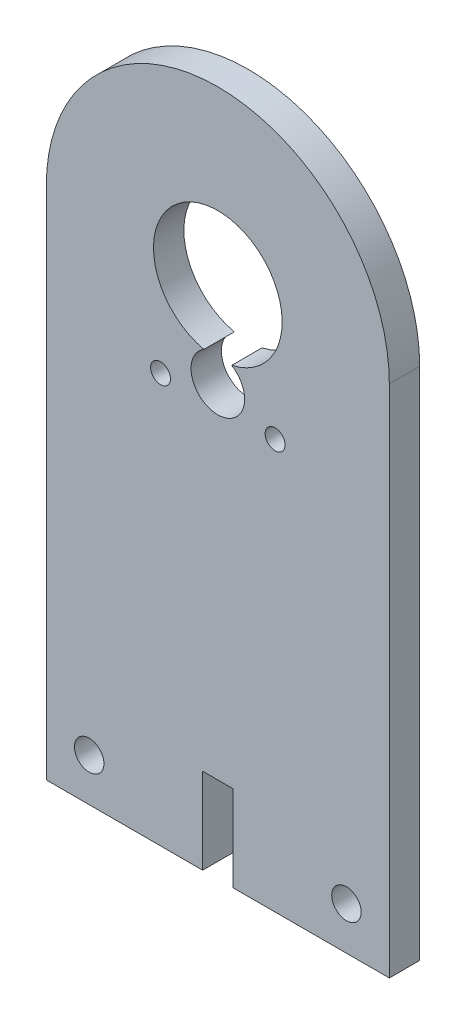
ISO-10303-21;
HEADER;
FILE_DESCRIPTION(('STEP AP214'),'2;1');
FILE_NAME('part.step','',(''),(''),'','','');
FILE_SCHEMA(('AUTOMOTIVE_DESIGN { 1 0 10303 214 1 1 1 1 }'));
ENDSEC;
DATA;
#1=APPLICATION_CONTEXT('core data for automotive mechanical design processes');
#2=APPLICATION_PROTOCOL_DEFINITION('international standard','automotive_design',2000,#1);
#3=PRODUCT_CONTEXT('',#1,'mechanical');
#4=PRODUCT('Part','Part','',(#3));
#5=PRODUCT_RELATED_PRODUCT_CATEGORY('part','',(#4));
#6=PRODUCT_DEFINITION_FORMATION('','',#4);
#7=PRODUCT_DEFINITION_CONTEXT('part definition',#1,'design');
#8=PRODUCT_DEFINITION('design','',#6,#7);
#9=PRODUCT_DEFINITION_SHAPE('','',#8);
#10=(LENGTH_UNIT() NAMED_UNIT(*) SI_UNIT(.MILLI.,.METRE.));
#11=(NAMED_UNIT(*) PLANE_ANGLE_UNIT() SI_UNIT($,.RADIAN.));
#12=(NAMED_UNIT(*) SI_UNIT($,.STERADIAN.) SOLID_ANGLE_UNIT());
#13=UNCERTAINTY_MEASURE_WITH_UNIT(LENGTH_MEASURE(1.E-05),#10,'distance_accuracy_value','');
#14=(GEOMETRIC_REPRESENTATION_CONTEXT(3) GLOBAL_UNCERTAINTY_ASSIGNED_CONTEXT((#13)) GLOBAL_UNIT_ASSIGNED_CONTEXT((#10,
#11,#12)) REPRESENTATION_CONTEXT('',''));
#15=CARTESIAN_POINT('',(0.,0.,0.));
#16=DIRECTION('',(0.,0.,1.));
#17=DIRECTION('',(1.,0.,0.));
#18=AXIS2_PLACEMENT_3D('',#15,#16,#17);
#19=CARTESIAN_POINT('',(0.,0.,4.4958));
#20=DIRECTION('',(0.,1.,0.));
#21=DIRECTION('',(0.,0.,1.));
#22=AXIS2_PLACEMENT_3D('',#19,#20,#21);
#23=PLANE('',#22);
#24=DIRECTION('',(1.,0.,0.));
#25=VECTOR('',#24,1.);
#26=CARTESIAN_POINT('',(0.,0.,0.));
#27=LINE('',#26,#25);
#28=CARTESIAN_POINT('',(0.,0.,0.));
#29=VERTEX_POINT('',#28);
#30=CARTESIAN_POINT('',(23.1521,0.,0.));
#31=VERTEX_POINT('',#30);
#32=EDGE_CURVE('E163',#29,#31,#27,.T.);
#33=ORIENTED_EDGE('',*,*,#32,.T.);
#34=DIRECTION('',(0.,0.,1.));
#35=VECTOR('',#34,1.);
#36=CARTESIAN_POINT('',(23.1521,0.,-1.8542));
#37=LINE('',#36,#35);
#38=CARTESIAN_POINT('',(23.1521,0.,4.4958));
#39=VERTEX_POINT('',#38);
#40=EDGE_CURVE('E138',#31,#39,#37,.T.);
#41=ORIENTED_EDGE('',*,*,#40,.T.);
#42=DIRECTION('',(1.,0.,0.));
#43=VECTOR('',#42,1.);
#44=CARTESIAN_POINT('',(0.,0.,4.4958));
#45=LINE('',#44,#43);
#46=CARTESIAN_POINT('',(0.,0.,4.4958));
#47=VERTEX_POINT('',#46);
#48=EDGE_CURVE('E152',#47,#39,#45,.T.);
#49=ORIENTED_EDGE('',*,*,#48,.F.);
#50=DIRECTION('',(0.,0.,-1.));
#51=VECTOR('',#50,1.);
#52=CARTESIAN_POINT('',(0.,0.,4.4958));
#53=LINE('',#52,#51);
#54=EDGE_CURVE('E177',#47,#29,#53,.T.);
#55=ORIENTED_EDGE('',*,*,#54,.T.);
#56=EDGE_LOOP('',(#33,#41,#49,#55));
#57=FACE_BOUND('',#56,.T.);
#58=ADVANCED_FACE('F36',(#57),#23,.F.);
#59=CARTESIAN_POINT('',(0.,0.,4.4958));
#60=DIRECTION('',(1.,0.,0.));
#61=DIRECTION('',(0.,0.,-1.));
#62=AXIS2_PLACEMENT_3D('',#59,#60,#61);
#63=PLANE('',#62);
#64=DIRECTION('',(0.,-1.,0.));
#65=VECTOR('',#64,1.);
#66=CARTESIAN_POINT('',(0.,0.,0.));
#67=LINE('',#66,#65);
#68=CARTESIAN_POINT('',(0.,76.2,0.));
#69=VERTEX_POINT('',#68);
#70=EDGE_CURVE('E141',#69,#29,#67,.T.);
#71=ORIENTED_EDGE('',*,*,#70,.T.);
#72=ORIENTED_EDGE('',*,*,#54,.F.);
#73=DIRECTION('',(0.,-1.,0.));
#74=VECTOR('',#73,1.);
#75=CARTESIAN_POINT('',(0.,0.,4.4958));
#76=LINE('',#75,#74);
#77=CARTESIAN_POINT('',(0.,76.2,4.4958));
#78=VERTEX_POINT('',#77);
#79=EDGE_CURVE('E147',#78,#47,#76,.T.);
#80=ORIENTED_EDGE('',*,*,#79,.F.);
#81=DIRECTION('',(0.,0.,-1.));
#82=VECTOR('',#81,1.);
#83=CARTESIAN_POINT('',(0.,76.2,4.4958));
#84=LINE('',#83,#82);
#85=EDGE_CURVE('E159',#78,#69,#84,.T.);
#86=ORIENTED_EDGE('',*,*,#85,.T.);
#87=EDGE_LOOP('',(#71,#72,#80,#86));
#88=FACE_BOUND('',#87,.T.);
#89=ADVANCED_FACE('F38',(#88),#63,.F.);
#90=CARTESIAN_POINT('',(27.6479,0.,4.4958));
#91=VERTEX_POINT('',#90);
#92=CARTESIAN_POINT('',(50.8,0.,4.4958));
#93=VERTEX_POINT('',#92);
#94=EDGE_CURVE('E150',#91,#93,#45,.T.);
#95=ORIENTED_EDGE('',*,*,#94,.F.);
#96=DIRECTION('',(0.,0.,1.));
#97=VECTOR('',#96,1.);
#98=CARTESIAN_POINT('',(27.6479,0.,-1.8542));
#99=LINE('',#98,#97);
#100=CARTESIAN_POINT('',(27.6479,0.,0.));
#101=VERTEX_POINT('',#100);
#102=EDGE_CURVE('E143',#101,#91,#99,.T.);
#103=ORIENTED_EDGE('',*,*,#102,.F.);
#104=CARTESIAN_POINT('',(50.8,0.,0.));
#105=VERTEX_POINT('',#104);
#106=EDGE_CURVE('E162',#101,#105,#27,.T.);
#107=ORIENTED_EDGE('',*,*,#106,.T.);
#108=DIRECTION('',(0.,0.,-1.));
#109=VECTOR('',#108,1.);
#110=CARTESIAN_POINT('',(50.8,0.,4.4958));
#111=LINE('',#110,#109);
#112=EDGE_CURVE('E174',#93,#105,#111,.T.);
#113=ORIENTED_EDGE('',*,*,#112,.F.);
#114=EDGE_LOOP('',(#95,#103,#107,#113));
#115=FACE_BOUND('',#114,.T.);
#116=ADVANCED_FACE('F209',(#115),#23,.F.);
#117=CARTESIAN_POINT('',(50.8,0.,4.4958));
#118=DIRECTION('',(-1.,0.,0.));
#119=DIRECTION('',(0.,0.,1.));
#120=AXIS2_PLACEMENT_3D('',#117,#118,#119);
#121=PLANE('',#120);
#122=DIRECTION('',(0.,1.,0.));
#123=VECTOR('',#122,1.);
#124=CARTESIAN_POINT('',(50.8,0.,0.));
#125=LINE('',#124,#123);
#126=CARTESIAN_POINT('',(50.8,76.2,0.));
#127=VERTEX_POINT('',#126);
#128=EDGE_CURVE('E166',#105,#127,#125,.T.);
#129=ORIENTED_EDGE('',*,*,#128,.T.);
#130=DIRECTION('',(0.,0.,-1.));
#131=VECTOR('',#130,1.);
#132=CARTESIAN_POINT('',(50.8,76.2,4.4958));
#133=LINE('',#132,#131);
#134=CARTESIAN_POINT('',(50.8,76.2,4.4958));
#135=VERTEX_POINT('',#134);
#136=EDGE_CURVE('E171',#135,#127,#133,.T.);
#137=ORIENTED_EDGE('',*,*,#136,.F.);
#138=DIRECTION('',(0.,1.,0.));
#139=VECTOR('',#138,1.);
#140=CARTESIAN_POINT('',(50.8,0.,4.4958));
#141=LINE('',#140,#139);
#142=EDGE_CURVE('E155',#93,#135,#141,.T.);
#143=ORIENTED_EDGE('',*,*,#142,.F.);
#144=ORIENTED_EDGE('',*,*,#112,.T.);
#145=EDGE_LOOP('',(#129,#137,#143,#144));
#146=FACE_BOUND('',#145,.T.);
#147=ADVANCED_FACE('F205',(#146),#121,.F.);
#148=CARTESIAN_POINT('',(25.4,76.2,4.4958));
#149=DIRECTION('',(0.,0.,-1.));
#150=DIRECTION('',(-1.,0.,0.));
#151=AXIS2_PLACEMENT_3D('',#148,#149,#150);
#152=CYLINDRICAL_SURFACE('',#151,25.4);
#153=CARTESIAN_POINT('',(25.4,76.2,0.));
#154=DIRECTION('',(0.,0.,1.));
#155=DIRECTION('',(1.,0.,0.));
#156=AXIS2_PLACEMENT_3D('',#153,#154,#155);
#157=CIRCLE('',#156,25.4);
#158=EDGE_CURVE('E151',#127,#69,#157,.T.);
#159=ORIENTED_EDGE('',*,*,#158,.T.);
#160=ORIENTED_EDGE('',*,*,#85,.F.);
#161=CARTESIAN_POINT('',(25.4,76.2,4.4958));
#162=DIRECTION('',(0.,0.,1.));
#163=DIRECTION('',(1.,0.,0.));
#164=AXIS2_PLACEMENT_3D('',#161,#162,#163);
#165=CIRCLE('',#164,25.4);
#166=EDGE_CURVE('E157',#135,#78,#165,.T.);
#167=ORIENTED_EDGE('',*,*,#166,.F.);
#168=ORIENTED_EDGE('',*,*,#136,.T.);
#169=EDGE_LOOP('',(#159,#160,#167,#168));
#170=FACE_BOUND('',#169,.T.);
#171=ADVANCED_FACE('F200',(#170),#152,.T.);
#172=CARTESIAN_POINT('',(25.4,76.2,4.4958));
#173=DIRECTION('',(0.,0.,1.));
#174=DIRECTION('',(1.,0.,0.));
#175=AXIS2_PLACEMENT_3D('',#172,#173,#174);
#176=PLANE('',#175);
#177=CARTESIAN_POINT('',(44.45,6.35,4.4958));
#178=DIRECTION('',(0.,0.,-1.));
#179=DIRECTION('',(-1.,0.,0.));
#180=AXIS2_PLACEMENT_3D('',#177,#178,#179);
#181=CIRCLE('',#180,2.182876);
#182=CARTESIAN_POINT('',(42.267124,6.35,4.4958));
#183=VERTEX_POINT('',#182);
#184=EDGE_CURVE('E251',#183,#183,#181,.T.);
#185=ORIENTED_EDGE('',*,*,#184,.T.);
#186=EDGE_LOOP('',(#185));
#187=FACE_BOUND('',#186,.T.);
#188=CARTESIAN_POINT('',(6.35,6.35,4.4958));
#189=DIRECTION('',(0.,0.,-1.));
#190=DIRECTION('',(-1.,0.,0.));
#191=AXIS2_PLACEMENT_3D('',#188,#189,#190);
#192=CIRCLE('',#191,2.182876);
#193=CARTESIAN_POINT('',(4.167124,6.35,4.4958));
#194=VERTEX_POINT('',#193);
#195=EDGE_CURVE('E255',#194,#194,#192,.T.);
#196=ORIENTED_EDGE('',*,*,#195,.T.);
#197=EDGE_LOOP('',(#196));
#198=FACE_BOUND('',#197,.T.);
#199=CARTESIAN_POINT('',(25.4,63.5,4.4958));
#200=DIRECTION('',(0.,0.,1.));
#201=DIRECTION('',(1.,0.,0.));
#202=AXIS2_PLACEMENT_3D('',#199,#200,#201);
#203=CIRCLE('',#202,3.96875);
#204=CARTESIAN_POINT('',(23.3498959544464,66.8982421875,4.4958));
#205=VERTEX_POINT('',#204);
#206=CARTESIAN_POINT('',(27.4501040455536,66.8982421875,4.4958));
#207=VERTEX_POINT('',#206);
#208=EDGE_CURVE('E112',#205,#207,#203,.T.);
#209=ORIENTED_EDGE('',*,*,#208,.F.);
#210=CARTESIAN_POINT('',(25.4,76.2,4.4958));
#211=DIRECTION('',(0.,0.,1.));
#212=DIRECTION('',(1.,0.,0.));
#213=AXIS2_PLACEMENT_3D('',#210,#211,#212);
#214=CIRCLE('',#213,9.525);
#215=EDGE_CURVE('E126',#207,#205,#214,.T.);
#216=ORIENTED_EDGE('',*,*,#215,.F.);
#217=EDGE_LOOP('',(#209,#216));
#218=FACE_BOUND('',#217,.T.);
#219=CARTESIAN_POINT('',(16.9164,60.6298,4.4958));
#220=DIRECTION('',(0.,0.,1.));
#221=DIRECTION('',(1.,0.,0.));
#222=AXIS2_PLACEMENT_3D('',#219,#220,#221);
#223=CIRCLE('',#222,1.47319999999999);
#224=CARTESIAN_POINT('',(18.3896,60.6298,4.4958));
#225=VERTEX_POINT('',#224);
#226=EDGE_CURVE('E122',#225,#225,#223,.T.);
#227=ORIENTED_EDGE('',*,*,#226,.F.);
#228=EDGE_LOOP('',(#227));
#229=FACE_BOUND('',#228,.T.);
#230=CARTESIAN_POINT('',(33.8836,60.6298,4.4958));
#231=DIRECTION('',(0.,0.,1.));
#232=DIRECTION('',(1.,0.,0.));
#233=AXIS2_PLACEMENT_3D('',#230,#231,#232);
#234=CIRCLE('',#233,1.47319999999999);
#235=CARTESIAN_POINT('',(35.3568,60.6298,4.4958));
#236=VERTEX_POINT('',#235);
#237=EDGE_CURVE('E262',#236,#236,#234,.T.);
#238=ORIENTED_EDGE('',*,*,#237,.F.);
#239=EDGE_LOOP('',(#238));
#240=FACE_BOUND('',#239,.T.);
#241=DIRECTION('',(0.,-1.,0.));
#242=VECTOR('',#241,1.);
#243=CARTESIAN_POINT('',(23.1521,0.,4.4958));
#244=LINE('',#243,#242);
#245=CARTESIAN_POINT('',(23.1521,12.7,4.4958));
#246=VERTEX_POINT('',#245);
#247=EDGE_CURVE('E125',#246,#39,#244,.T.);
#248=ORIENTED_EDGE('',*,*,#247,.F.);
#249=DIRECTION('',(-1.,0.,0.));
#250=VECTOR('',#249,1.);
#251=CARTESIAN_POINT('',(23.1521,12.7,4.4958));
#252=LINE('',#251,#250);
#253=CARTESIAN_POINT('',(27.6479,12.7,4.4958));
#254=VERTEX_POINT('',#253);
#255=EDGE_CURVE('E135',#254,#246,#252,.T.);
#256=ORIENTED_EDGE('',*,*,#255,.F.);
#257=DIRECTION('',(0.,1.,0.));
#258=VECTOR('',#257,1.);
#259=CARTESIAN_POINT('',(27.6479,0.,4.4958));
#260=LINE('',#259,#258);
#261=EDGE_CURVE('E128',#91,#254,#260,.T.);
#262=ORIENTED_EDGE('',*,*,#261,.F.);
#263=ORIENTED_EDGE('',*,*,#94,.T.);
#264=ORIENTED_EDGE('',*,*,#142,.T.);
#265=ORIENTED_EDGE('',*,*,#166,.T.);
#266=ORIENTED_EDGE('',*,*,#79,.T.);
#267=ORIENTED_EDGE('',*,*,#48,.T.);
#268=EDGE_LOOP('',(#248,#256,#262,#263,#264,#265,#266,#267));
#269=FACE_BOUND('',#268,.T.);
#270=ADVANCED_FACE('F216',(#187,#198,#218,#229,#240,#269),#176,.T.);
#271=CARTESIAN_POINT('',(25.4,76.2,0.));
#272=DIRECTION('',(0.,0.,1.));
#273=DIRECTION('',(1.,0.,0.));
#274=AXIS2_PLACEMENT_3D('',#271,#272,#273);
#275=PLANE('',#274);
#276=CARTESIAN_POINT('',(44.45,6.35,0.));
#277=DIRECTION('',(0.,0.,-1.));
#278=DIRECTION('',(-1.,0.,0.));
#279=AXIS2_PLACEMENT_3D('',#276,#277,#278);
#280=CIRCLE('',#279,2.18287599999999);
#281=CARTESIAN_POINT('',(42.267124,6.35,0.));
#282=VERTEX_POINT('',#281);
#283=EDGE_CURVE('E277',#282,#282,#280,.T.);
#284=ORIENTED_EDGE('',*,*,#283,.F.);
#285=EDGE_LOOP('',(#284));
#286=FACE_BOUND('',#285,.T.);
#287=CARTESIAN_POINT('',(6.35,6.35,0.));
#288=DIRECTION('',(0.,0.,-1.));
#289=DIRECTION('',(-1.,0.,0.));
#290=AXIS2_PLACEMENT_3D('',#287,#288,#289);
#291=CIRCLE('',#290,2.18287599999999);
#292=CARTESIAN_POINT('',(4.16712400000001,6.35,0.));
#293=VERTEX_POINT('',#292);
#294=EDGE_CURVE('E273',#293,#293,#291,.T.);
#295=ORIENTED_EDGE('',*,*,#294,.F.);
#296=EDGE_LOOP('',(#295));
#297=FACE_BOUND('',#296,.T.);
#298=CARTESIAN_POINT('',(16.9164,60.6298,0.));
#299=DIRECTION('',(0.,0.,1.));
#300=DIRECTION('',(1.,0.,0.));
#301=AXIS2_PLACEMENT_3D('',#298,#299,#300);
#302=CIRCLE('',#301,1.4732);
#303=CARTESIAN_POINT('',(18.3896,60.6298,0.));
#304=VERTEX_POINT('',#303);
#305=EDGE_CURVE('E264',#304,#304,#302,.T.);
#306=ORIENTED_EDGE('',*,*,#305,.T.);
#307=EDGE_LOOP('',(#306));
#308=FACE_BOUND('',#307,.T.);
#309=CARTESIAN_POINT('',(33.8836,60.6298,0.));
#310=DIRECTION('',(0.,0.,1.));
#311=DIRECTION('',(1.,0.,0.));
#312=AXIS2_PLACEMENT_3D('',#309,#310,#311);
#313=CIRCLE('',#312,1.4732);
#314=CARTESIAN_POINT('',(35.3568,60.6298,0.));
#315=VERTEX_POINT('',#314);
#316=EDGE_CURVE('E130',#315,#315,#313,.T.);
#317=ORIENTED_EDGE('',*,*,#316,.T.);
#318=EDGE_LOOP('',(#317));
#319=FACE_BOUND('',#318,.T.);
#320=CARTESIAN_POINT('',(25.4,76.2,0.));
#321=DIRECTION('',(0.,0.,1.));
#322=DIRECTION('',(1.,0.,0.));
#323=AXIS2_PLACEMENT_3D('',#320,#321,#322);
#324=CIRCLE('',#323,9.525);
#325=CARTESIAN_POINT('',(27.4501040455536,66.8982421875,0.));
#326=VERTEX_POINT('',#325);
#327=CARTESIAN_POINT('',(23.3498959544464,66.8982421875,0.));
#328=VERTEX_POINT('',#327);
#329=EDGE_CURVE('E121',#326,#328,#324,.T.);
#330=ORIENTED_EDGE('',*,*,#329,.T.);
#331=CARTESIAN_POINT('',(25.4,63.5,0.));
#332=DIRECTION('',(0.,0.,1.));
#333=DIRECTION('',(1.,0.,0.));
#334=AXIS2_PLACEMENT_3D('',#331,#332,#333);
#335=CIRCLE('',#334,3.96875);
#336=EDGE_CURVE('E51',#328,#326,#335,.T.);
#337=ORIENTED_EDGE('',*,*,#336,.T.);
#338=EDGE_LOOP('',(#330,#337));
#339=FACE_BOUND('',#338,.T.);
#340=DIRECTION('',(-1.,0.,0.));
#341=VECTOR('',#340,1.);
#342=CARTESIAN_POINT('',(25.4,12.7,0.));
#343=LINE('',#342,#341);
#344=CARTESIAN_POINT('',(27.6479,12.7,0.));
#345=VERTEX_POINT('',#344);
#346=CARTESIAN_POINT('',(23.1521,12.7,0.));
#347=VERTEX_POINT('',#346);
#348=EDGE_CURVE('E183',#345,#347,#343,.T.);
#349=ORIENTED_EDGE('',*,*,#348,.T.);
#350=DIRECTION('',(0.,-1.,0.));
#351=VECTOR('',#350,1.);
#352=CARTESIAN_POINT('',(23.1521,76.2,0.));
#353=LINE('',#352,#351);
#354=EDGE_CURVE('E186',#347,#31,#353,.T.);
#355=ORIENTED_EDGE('',*,*,#354,.T.);
#356=ORIENTED_EDGE('',*,*,#32,.F.);
#357=ORIENTED_EDGE('',*,*,#70,.F.);
#358=ORIENTED_EDGE('',*,*,#158,.F.);
#359=ORIENTED_EDGE('',*,*,#128,.F.);
#360=ORIENTED_EDGE('',*,*,#106,.F.);
#361=DIRECTION('',(0.,1.,0.));
#362=VECTOR('',#361,1.);
#363=CARTESIAN_POINT('',(27.6479,76.2,0.));
#364=LINE('',#363,#362);
#365=EDGE_CURVE('E180',#101,#345,#364,.T.);
#366=ORIENTED_EDGE('',*,*,#365,.T.);
#367=EDGE_LOOP('',(#349,#355,#356,#357,#358,#359,#360,#366));
#368=FACE_BOUND('',#367,.T.);
#369=ADVANCED_FACE('F119',(#286,#297,#308,#319,#339,#368),#275,.F.);
#370=CARTESIAN_POINT('',(23.1521,0.,-1.8542));
#371=DIRECTION('',(-1.,0.,0.));
#372=DIRECTION('',(0.,0.,1.));
#373=AXIS2_PLACEMENT_3D('',#370,#371,#372);
#374=PLANE('',#373);
#375=DIRECTION('',(0.,0.,1.));
#376=VECTOR('',#375,1.);
#377=CARTESIAN_POINT('',(23.1521,12.7,-1.8542));
#378=LINE('',#377,#376);
#379=EDGE_CURVE('E139',#347,#246,#378,.T.);
#380=ORIENTED_EDGE('',*,*,#379,.T.);
#381=ORIENTED_EDGE('',*,*,#247,.T.);
#382=ORIENTED_EDGE('',*,*,#40,.F.);
#383=ORIENTED_EDGE('',*,*,#354,.F.);
#384=EDGE_LOOP('',(#380,#381,#382,#383));
#385=FACE_BOUND('',#384,.T.);
#386=ADVANCED_FACE('F219',(#385),#374,.F.);
#387=CARTESIAN_POINT('',(23.1521,12.7,-1.8542));
#388=DIRECTION('',(0.,1.,0.));
#389=DIRECTION('',(0.,0.,1.));
#390=AXIS2_PLACEMENT_3D('',#387,#388,#389);
#391=PLANE('',#390);
#392=DIRECTION('',(0.,0.,1.));
#393=VECTOR('',#392,1.);
#394=CARTESIAN_POINT('',(27.6479,12.7,-1.8542));
#395=LINE('',#394,#393);
#396=EDGE_CURVE('E59',#345,#254,#395,.T.);
#397=ORIENTED_EDGE('',*,*,#396,.T.);
#398=ORIENTED_EDGE('',*,*,#255,.T.);
#399=ORIENTED_EDGE('',*,*,#379,.F.);
#400=ORIENTED_EDGE('',*,*,#348,.F.);
#401=EDGE_LOOP('',(#397,#398,#399,#400));
#402=FACE_BOUND('',#401,.T.);
#403=ADVANCED_FACE('F218',(#402),#391,.F.);
#404=CARTESIAN_POINT('',(27.6479,0.,-1.8542));
#405=DIRECTION('',(1.,0.,0.));
#406=DIRECTION('',(0.,1.,0.));
#407=AXIS2_PLACEMENT_3D('',#404,#405,#406);
#408=PLANE('',#407);
#409=ORIENTED_EDGE('',*,*,#102,.T.);
#410=ORIENTED_EDGE('',*,*,#261,.T.);
#411=ORIENTED_EDGE('',*,*,#396,.F.);
#412=ORIENTED_EDGE('',*,*,#365,.F.);
#413=EDGE_LOOP('',(#409,#410,#411,#412));
#414=FACE_BOUND('',#413,.T.);
#415=ADVANCED_FACE('F211',(#414),#408,.F.);
#416=CARTESIAN_POINT('',(25.4,76.2,4.4958));
#417=DIRECTION('',(0.,0.,1.));
#418=DIRECTION('',(1.,0.,0.));
#419=AXIS2_PLACEMENT_3D('',#416,#417,#418);
#420=CYLINDRICAL_SURFACE('',#419,9.525);
#421=ORIENTED_EDGE('',*,*,#329,.F.);
#422=DIRECTION('',(0.,0.,1.));
#423=VECTOR('',#422,1.);
#424=CARTESIAN_POINT('',(27.4501040455536,66.8982421875,2.2479));
#425=LINE('',#424,#423);
#426=EDGE_CURVE('E11',#326,#207,#425,.T.);
#427=ORIENTED_EDGE('',*,*,#426,.T.);
#428=ORIENTED_EDGE('',*,*,#215,.T.);
#429=DIRECTION('',(0.,0.,1.));
#430=VECTOR('',#429,1.);
#431=CARTESIAN_POINT('',(23.3498959544464,66.8982421875,2.2479));
#432=LINE('',#431,#430);
#433=EDGE_CURVE('E44',#205,#328,#432,.F.);
#434=ORIENTED_EDGE('',*,*,#433,.T.);
#435=EDGE_LOOP('',(#421,#427,#428,#434));
#436=FACE_BOUND('',#435,.T.);
#437=ADVANCED_FACE('F124',(#436),#420,.F.);
#438=CARTESIAN_POINT('',(33.8836,60.6298,4.4958));
#439=DIRECTION('',(0.,0.,1.));
#440=DIRECTION('',(1.,0.,0.));
#441=AXIS2_PLACEMENT_3D('',#438,#439,#440);
#442=CYLINDRICAL_SURFACE('',#441,1.4732);
#443=ORIENTED_EDGE('',*,*,#316,.F.);
#444=EDGE_LOOP('',(#443));
#445=FACE_BOUND('',#444,.T.);
#446=ORIENTED_EDGE('',*,*,#237,.T.);
#447=EDGE_LOOP('',(#446));
#448=FACE_BOUND('',#447,.T.);
#449=ADVANCED_FACE('F289',(#445,#448),#442,.F.);
#450=CARTESIAN_POINT('',(16.9164,60.6298,4.4958));
#451=DIRECTION('',(0.,0.,1.));
#452=DIRECTION('',(1.,0.,0.));
#453=AXIS2_PLACEMENT_3D('',#450,#451,#452);
#454=CYLINDRICAL_SURFACE('',#453,1.4732);
#455=ORIENTED_EDGE('',*,*,#305,.F.);
#456=EDGE_LOOP('',(#455));
#457=FACE_BOUND('',#456,.T.);
#458=ORIENTED_EDGE('',*,*,#226,.T.);
#459=EDGE_LOOP('',(#458));
#460=FACE_BOUND('',#459,.T.);
#461=ADVANCED_FACE('F291',(#457,#460),#454,.F.);
#462=CARTESIAN_POINT('',(25.4,63.5,4.4958));
#463=DIRECTION('',(0.,0.,1.));
#464=DIRECTION('',(1.,0.,0.));
#465=AXIS2_PLACEMENT_3D('',#462,#463,#464);
#466=CYLINDRICAL_SURFACE('',#465,3.96875);
#467=ORIENTED_EDGE('',*,*,#336,.F.);
#468=ORIENTED_EDGE('',*,*,#433,.F.);
#469=ORIENTED_EDGE('',*,*,#208,.T.);
#470=ORIENTED_EDGE('',*,*,#426,.F.);
#471=EDGE_LOOP('',(#467,#468,#469,#470));
#472=FACE_BOUND('',#471,.T.);
#473=ADVANCED_FACE('F110',(#472),#466,.F.);
#474=CARTESIAN_POINT('',(6.35,6.35,0.));
#475=DIRECTION('',(0.,0.,-1.));
#476=DIRECTION('',(-1.,0.,0.));
#477=AXIS2_PLACEMENT_3D('',#474,#475,#476);
#478=CYLINDRICAL_SURFACE('',#477,2.18287599999999);
#479=ORIENTED_EDGE('',*,*,#195,.F.);
#480=EDGE_LOOP('',(#479));
#481=FACE_BOUND('',#480,.T.);
#482=ORIENTED_EDGE('',*,*,#294,.T.);
#483=EDGE_LOOP('',(#482));
#484=FACE_BOUND('',#483,.T.);
#485=ADVANCED_FACE('F322',(#481,#484),#478,.F.);
#486=CARTESIAN_POINT('',(44.45,6.35,0.));
#487=DIRECTION('',(0.,0.,-1.));
#488=DIRECTION('',(-1.,0.,0.));
#489=AXIS2_PLACEMENT_3D('',#486,#487,#488);
#490=CYLINDRICAL_SURFACE('',#489,2.18287599999999);
#491=ORIENTED_EDGE('',*,*,#184,.F.);
#492=EDGE_LOOP('',(#491));
#493=FACE_BOUND('',#492,.T.);
#494=ORIENTED_EDGE('',*,*,#283,.T.);
#495=EDGE_LOOP('',(#494));
#496=FACE_BOUND('',#495,.T.);
#497=ADVANCED_FACE('F281',(#493,#496),#490,.F.);
#498=CLOSED_SHELL('',(#58,#89,#116,#147,#171,#270,#369,#386,#403,#415,#437,#449,#461,#473,#485,#497));
#499=MANIFOLD_SOLID_BREP('B2',#498);
#500=ADVANCED_BREP_SHAPE_REPRESENTATION('',(#18,#499),#14);
#501=SHAPE_DEFINITION_REPRESENTATION(#9,#500);
ENDSEC;
END-ISO-10303-21;
